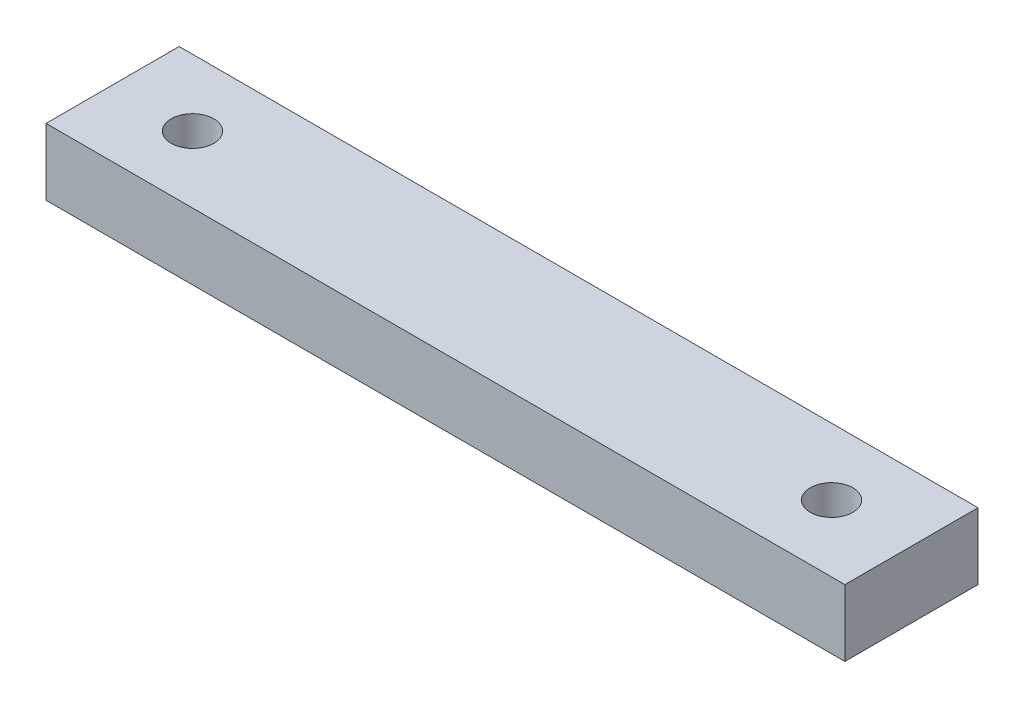
ISO-10303-21;
HEADER;
FILE_DESCRIPTION(('STEP AP214'),'2;1');
FILE_NAME('part.step','',(''),(''),'','','');
FILE_SCHEMA(('AUTOMOTIVE_DESIGN { 1 0 10303 214 1 1 1 1 }'));
ENDSEC;
DATA;
#1=APPLICATION_CONTEXT('core data for automotive mechanical design processes');
#2=APPLICATION_PROTOCOL_DEFINITION('international standard','automotive_design',2000,#1);
#3=PRODUCT_CONTEXT('',#1,'mechanical');
#4=PRODUCT('Part','Part','',(#3));
#5=PRODUCT_RELATED_PRODUCT_CATEGORY('part','',(#4));
#6=PRODUCT_DEFINITION_FORMATION('','',#4);
#7=PRODUCT_DEFINITION_CONTEXT('part definition',#1,'design');
#8=PRODUCT_DEFINITION('design','',#6,#7);
#9=PRODUCT_DEFINITION_SHAPE('','',#8);
#10=(LENGTH_UNIT() NAMED_UNIT(*) SI_UNIT(.MILLI.,.METRE.));
#11=(NAMED_UNIT(*) PLANE_ANGLE_UNIT() SI_UNIT($,.RADIAN.));
#12=(NAMED_UNIT(*) SI_UNIT($,.STERADIAN.) SOLID_ANGLE_UNIT());
#13=UNCERTAINTY_MEASURE_WITH_UNIT(LENGTH_MEASURE(1.E-05),#10,'distance_accuracy_value','');
#14=(GEOMETRIC_REPRESENTATION_CONTEXT(3) GLOBAL_UNCERTAINTY_ASSIGNED_CONTEXT((#13)) GLOBAL_UNIT_ASSIGNED_CONTEXT((#10,
#11,#12)) REPRESENTATION_CONTEXT('',''));
#15=CARTESIAN_POINT('',(0.,0.,0.));
#16=DIRECTION('',(0.,0.,1.));
#17=DIRECTION('',(1.,0.,0.));
#18=AXIS2_PLACEMENT_3D('',#15,#16,#17);
#19=CARTESIAN_POINT('',(0.,5.,0.));
#20=DIRECTION('',(0.,-1.,0.));
#21=DIRECTION('',(0.,0.,-1.));
#22=AXIS2_PLACEMENT_3D('',#19,#20,#21);
#23=PLANE('',#22);
#24=DIRECTION('',(0.,0.,-1.));
#25=VECTOR('',#24,1.);
#26=CARTESIAN_POINT('',(30.,5.,5.));
#27=LINE('',#26,#25);
#28=CARTESIAN_POINT('',(30.,5.,5.));
#29=VERTEX_POINT('',#28);
#30=CARTESIAN_POINT('',(30.,5.,-5.));
#31=VERTEX_POINT('',#30);
#32=EDGE_CURVE('E98',#29,#31,#27,.T.);
#33=ORIENTED_EDGE('',*,*,#32,.T.);
#34=DIRECTION('',(-1.,0.,0.));
#35=VECTOR('',#34,1.);
#36=CARTESIAN_POINT('',(-30.,5.,-5.));
#37=LINE('',#36,#35);
#38=CARTESIAN_POINT('',(-30.,5.,-5.));
#39=VERTEX_POINT('',#38);
#40=EDGE_CURVE('E93',#31,#39,#37,.T.);
#41=ORIENTED_EDGE('',*,*,#40,.T.);
#42=DIRECTION('',(0.,0.,1.));
#43=VECTOR('',#42,1.);
#44=CARTESIAN_POINT('',(-30.,5.,5.));
#45=LINE('',#44,#43);
#46=CARTESIAN_POINT('',(-30.,5.,5.));
#47=VERTEX_POINT('',#46);
#48=EDGE_CURVE('E96',#39,#47,#45,.T.);
#49=ORIENTED_EDGE('',*,*,#48,.T.);
#50=DIRECTION('',(1.,0.,0.));
#51=VECTOR('',#50,1.);
#52=CARTESIAN_POINT('',(-30.,5.,5.));
#53=LINE('',#52,#51);
#54=EDGE_CURVE('E63',#47,#29,#53,.T.);
#55=ORIENTED_EDGE('',*,*,#54,.T.);
#56=EDGE_LOOP('',(#33,#41,#49,#55));
#57=FACE_BOUND('',#56,.T.);
#58=CARTESIAN_POINT('',(-24.,5.,0.));
#59=DIRECTION('',(0.,1.,0.));
#60=DIRECTION('',(0.,0.,1.));
#61=AXIS2_PLACEMENT_3D('',#58,#59,#60);
#62=CIRCLE('',#61,1.6);
#63=CARTESIAN_POINT('',(-24.,5.,1.6));
#64=VERTEX_POINT('',#63);
#65=EDGE_CURVE('E118',#64,#64,#62,.T.);
#66=ORIENTED_EDGE('',*,*,#65,.F.);
#67=EDGE_LOOP('',(#66));
#68=FACE_BOUND('',#67,.T.);
#69=CARTESIAN_POINT('',(24.,5.,0.));
#70=DIRECTION('',(0.,1.,0.));
#71=DIRECTION('',(0.,0.,-1.));
#72=AXIS2_PLACEMENT_3D('',#69,#70,#71);
#73=CIRCLE('',#72,1.6);
#74=CARTESIAN_POINT('',(24.,5.,-1.6));
#75=VERTEX_POINT('',#74);
#76=EDGE_CURVE('E140',#75,#75,#73,.T.);
#77=ORIENTED_EDGE('',*,*,#76,.F.);
#78=EDGE_LOOP('',(#77));
#79=FACE_BOUND('',#78,.T.);
#80=ADVANCED_FACE('F45',(#57,#68,#79),#23,.F.);
#81=CARTESIAN_POINT('',(0.,0.,0.));
#82=DIRECTION('',(0.,-1.,0.));
#83=DIRECTION('',(0.,0.,-1.));
#84=AXIS2_PLACEMENT_3D('',#81,#82,#83);
#85=PLANE('',#84);
#86=CARTESIAN_POINT('',(-24.,0.,0.));
#87=DIRECTION('',(0.,1.,0.));
#88=DIRECTION('',(0.,0.,1.));
#89=AXIS2_PLACEMENT_3D('',#86,#87,#88);
#90=CIRCLE('',#89,1.6);
#91=CARTESIAN_POINT('',(-24.,0.,1.6));
#92=VERTEX_POINT('',#91);
#93=EDGE_CURVE('E136',#92,#92,#90,.T.);
#94=ORIENTED_EDGE('',*,*,#93,.T.);
#95=EDGE_LOOP('',(#94));
#96=FACE_BOUND('',#95,.T.);
#97=DIRECTION('',(0.,0.,-1.));
#98=VECTOR('',#97,1.);
#99=CARTESIAN_POINT('',(30.,0.,5.));
#100=LINE('',#99,#98);
#101=CARTESIAN_POINT('',(30.,0.,5.));
#102=VERTEX_POINT('',#101);
#103=CARTESIAN_POINT('',(30.,0.,-5.));
#104=VERTEX_POINT('',#103);
#105=EDGE_CURVE('E114',#102,#104,#100,.T.);
#106=ORIENTED_EDGE('',*,*,#105,.F.);
#107=DIRECTION('',(1.,0.,0.));
#108=VECTOR('',#107,1.);
#109=CARTESIAN_POINT('',(-30.,0.,5.));
#110=LINE('',#109,#108);
#111=CARTESIAN_POINT('',(-30.,0.,5.));
#112=VERTEX_POINT('',#111);
#113=EDGE_CURVE('E86',#112,#102,#110,.T.);
#114=ORIENTED_EDGE('',*,*,#113,.F.);
#115=DIRECTION('',(0.,0.,1.));
#116=VECTOR('',#115,1.);
#117=CARTESIAN_POINT('',(-30.,0.,5.));
#118=LINE('',#117,#116);
#119=CARTESIAN_POINT('',(-30.,0.,-5.));
#120=VERTEX_POINT('',#119);
#121=EDGE_CURVE('E80',#120,#112,#118,.T.);
#122=ORIENTED_EDGE('',*,*,#121,.F.);
#123=DIRECTION('',(-1.,0.,0.));
#124=VECTOR('',#123,1.);
#125=CARTESIAN_POINT('',(-30.,0.,-5.));
#126=LINE('',#125,#124);
#127=EDGE_CURVE('E103',#104,#120,#126,.T.);
#128=ORIENTED_EDGE('',*,*,#127,.F.);
#129=EDGE_LOOP('',(#106,#114,#122,#128));
#130=FACE_BOUND('',#129,.T.);
#131=CARTESIAN_POINT('',(24.,0.,0.));
#132=DIRECTION('',(0.,1.,0.));
#133=DIRECTION('',(0.,0.,-1.));
#134=AXIS2_PLACEMENT_3D('',#131,#132,#133);
#135=CIRCLE('',#134,1.6);
#136=CARTESIAN_POINT('',(24.,0.,-1.6));
#137=VERTEX_POINT('',#136);
#138=EDGE_CURVE('E144',#137,#137,#135,.T.);
#139=ORIENTED_EDGE('',*,*,#138,.T.);
#140=EDGE_LOOP('',(#139));
#141=FACE_BOUND('',#140,.T.);
#142=ADVANCED_FACE('F131',(#96,#130,#141),#85,.T.);
#143=CARTESIAN_POINT('',(30.,5.,5.));
#144=DIRECTION('',(-1.,0.,0.));
#145=DIRECTION('',(0.,0.,1.));
#146=AXIS2_PLACEMENT_3D('',#143,#144,#145);
#147=PLANE('',#146);
#148=ORIENTED_EDGE('',*,*,#105,.T.);
#149=DIRECTION('',(0.,-1.,0.));
#150=VECTOR('',#149,1.);
#151=CARTESIAN_POINT('',(30.,5.,-5.));
#152=LINE('',#151,#150);
#153=EDGE_CURVE('E11',#31,#104,#152,.T.);
#154=ORIENTED_EDGE('',*,*,#153,.F.);
#155=ORIENTED_EDGE('',*,*,#32,.F.);
#156=DIRECTION('',(0.,-1.,0.));
#157=VECTOR('',#156,1.);
#158=CARTESIAN_POINT('',(30.,5.,5.));
#159=LINE('',#158,#157);
#160=EDGE_CURVE('E110',#29,#102,#159,.T.);
#161=ORIENTED_EDGE('',*,*,#160,.T.);
#162=EDGE_LOOP('',(#148,#154,#155,#161));
#163=FACE_BOUND('',#162,.T.);
#164=ADVANCED_FACE('F47',(#163),#147,.F.);
#165=CARTESIAN_POINT('',(-30.,5.,-5.));
#166=DIRECTION('',(0.,0.,1.));
#167=DIRECTION('',(1.,0.,0.));
#168=AXIS2_PLACEMENT_3D('',#165,#166,#167);
#169=PLANE('',#168);
#170=ORIENTED_EDGE('',*,*,#127,.T.);
#171=DIRECTION('',(0.,-1.,0.));
#172=VECTOR('',#171,1.);
#173=CARTESIAN_POINT('',(-30.,5.,-5.));
#174=LINE('',#173,#172);
#175=EDGE_CURVE('E55',#39,#120,#174,.T.);
#176=ORIENTED_EDGE('',*,*,#175,.F.);
#177=ORIENTED_EDGE('',*,*,#40,.F.);
#178=ORIENTED_EDGE('',*,*,#153,.T.);
#179=EDGE_LOOP('',(#170,#176,#177,#178));
#180=FACE_BOUND('',#179,.T.);
#181=ADVANCED_FACE('F102',(#180),#169,.F.);
#182=CARTESIAN_POINT('',(-30.,5.,5.));
#183=DIRECTION('',(1.,0.,0.));
#184=DIRECTION('',(0.,0.,-1.));
#185=AXIS2_PLACEMENT_3D('',#182,#183,#184);
#186=PLANE('',#185);
#187=ORIENTED_EDGE('',*,*,#121,.T.);
#188=DIRECTION('',(0.,-1.,0.));
#189=VECTOR('',#188,1.);
#190=CARTESIAN_POINT('',(-30.,5.,5.));
#191=LINE('',#190,#189);
#192=EDGE_CURVE('E105',#47,#112,#191,.T.);
#193=ORIENTED_EDGE('',*,*,#192,.F.);
#194=ORIENTED_EDGE('',*,*,#48,.F.);
#195=ORIENTED_EDGE('',*,*,#175,.T.);
#196=EDGE_LOOP('',(#187,#193,#194,#195));
#197=FACE_BOUND('',#196,.T.);
#198=ADVANCED_FACE('F106',(#197),#186,.F.);
#199=CARTESIAN_POINT('',(-30.,5.,5.));
#200=DIRECTION('',(0.,0.,-1.));
#201=DIRECTION('',(-1.,0.,0.));
#202=AXIS2_PLACEMENT_3D('',#199,#200,#201);
#203=PLANE('',#202);
#204=ORIENTED_EDGE('',*,*,#113,.T.);
#205=ORIENTED_EDGE('',*,*,#160,.F.);
#206=ORIENTED_EDGE('',*,*,#54,.F.);
#207=ORIENTED_EDGE('',*,*,#192,.T.);
#208=EDGE_LOOP('',(#204,#205,#206,#207));
#209=FACE_BOUND('',#208,.T.);
#210=ADVANCED_FACE('F128',(#209),#203,.F.);
#211=CARTESIAN_POINT('',(-24.,5.,0.));
#212=DIRECTION('',(0.,-1.,0.));
#213=DIRECTION('',(0.,0.,-1.));
#214=AXIS2_PLACEMENT_3D('',#211,#212,#213);
#215=CYLINDRICAL_SURFACE('',#214,1.6);
#216=ORIENTED_EDGE('',*,*,#65,.T.);
#217=EDGE_LOOP('',(#216));
#218=FACE_BOUND('',#217,.T.);
#219=ORIENTED_EDGE('',*,*,#93,.F.);
#220=EDGE_LOOP('',(#219));
#221=FACE_BOUND('',#220,.T.);
#222=ADVANCED_FACE('F163',(#218,#221),#215,.F.);
#223=CARTESIAN_POINT('',(24.,5.,0.));
#224=DIRECTION('',(0.,-1.,0.));
#225=DIRECTION('',(0.,0.,-1.));
#226=AXIS2_PLACEMENT_3D('',#223,#224,#225);
#227=CYLINDRICAL_SURFACE('',#226,1.6);
#228=ORIENTED_EDGE('',*,*,#76,.T.);
#229=EDGE_LOOP('',(#228));
#230=FACE_BOUND('',#229,.T.);
#231=ORIENTED_EDGE('',*,*,#138,.F.);
#232=EDGE_LOOP('',(#231));
#233=FACE_BOUND('',#232,.T.);
#234=ADVANCED_FACE('F152',(#230,#233),#227,.F.);
#235=CLOSED_SHELL('',(#80,#142,#164,#181,#198,#210,#222,#234));
#236=MANIFOLD_SOLID_BREP('B2',#235);
#237=ADVANCED_BREP_SHAPE_REPRESENTATION('',(#18,#236),#14);
#238=SHAPE_DEFINITION_REPRESENTATION(#9,#237);
ENDSEC;
END-ISO-10303-21;
